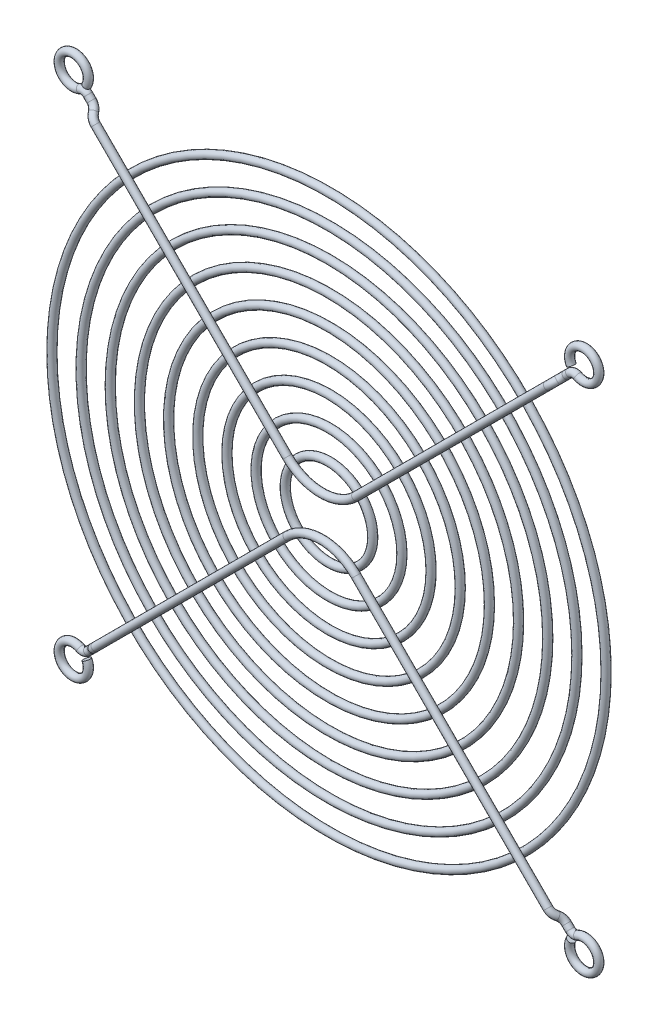
ISO-10303-21;
HEADER;
FILE_DESCRIPTION(('STEP AP214'),'2;1');
FILE_NAME('part.step','',(''),(''),'','','');
FILE_SCHEMA(('AUTOMOTIVE_DESIGN { 1 0 10303 214 1 1 1 1 }'));
ENDSEC;
DATA;
#1=APPLICATION_CONTEXT('core data for automotive mechanical design processes');
#2=APPLICATION_PROTOCOL_DEFINITION('international standard','automotive_design',2000,#1);
#3=PRODUCT_CONTEXT('',#1,'mechanical');
#4=PRODUCT('Part','Part','',(#3));
#5=PRODUCT_RELATED_PRODUCT_CATEGORY('part','',(#4));
#6=PRODUCT_DEFINITION_FORMATION('','',#4);
#7=PRODUCT_DEFINITION_CONTEXT('part definition',#1,'design');
#8=PRODUCT_DEFINITION('design','',#6,#7);
#9=PRODUCT_DEFINITION_SHAPE('','',#8);
#10=(LENGTH_UNIT() NAMED_UNIT(*) SI_UNIT(.MILLI.,.METRE.));
#11=(NAMED_UNIT(*) PLANE_ANGLE_UNIT() SI_UNIT($,.RADIAN.));
#12=(NAMED_UNIT(*) SI_UNIT($,.STERADIAN.) SOLID_ANGLE_UNIT());
#13=UNCERTAINTY_MEASURE_WITH_UNIT(LENGTH_MEASURE(1.E-05),#10,'distance_accuracy_value','');
#14=(GEOMETRIC_REPRESENTATION_CONTEXT(3) GLOBAL_UNCERTAINTY_ASSIGNED_CONTEXT((#13)) GLOBAL_UNIT_ASSIGNED_CONTEXT((#10,
#11,#12)) REPRESENTATION_CONTEXT('',''));
#15=CARTESIAN_POINT('',(0.,0.,0.));
#16=DIRECTION('',(0.,0.,1.));
#17=DIRECTION('',(1.,0.,0.));
#18=AXIS2_PLACEMENT_3D('',#15,#16,#17);
#19=CARTESIAN_POINT('',(-39.5979797464466,-39.5979797464467,1.5));
#20=DIRECTION('',(0.707106781186546,0.707106781186549,0.));
#21=DIRECTION('',(0.707106781186549,-0.707106781186546,0.));
#22=AXIS2_PLACEMENT_3D('',#19,#20,#21);
#23=CYLINDRICAL_SURFACE('',#22,0.75);
#24=CARTESIAN_POINT('',(-7.07106781186549,-7.07106781186551,1.5));
#25=DIRECTION('',(-0.707106781186546,-0.707106781186549,0.));
#26=DIRECTION('',(0.,0.,-1.));
#27=AXIS2_PLACEMENT_3D('',#24,#25,#26);
#28=CIRCLE('',#27,0.75);
#29=CARTESIAN_POINT('',(-7.6013978977554,-6.5407377259756,1.5));
#30=VERTEX_POINT('',#29);
#31=EDGE_CURVE('E11',#30,#30,#28,.T.);
#32=ORIENTED_EDGE('',*,*,#31,.T.);
#33=EDGE_LOOP('',(#32));
#34=FACE_BOUND('',#33,.T.);
#35=CARTESIAN_POINT('',(-46.5332744590506,-46.5332744590507,1.5));
#36=DIRECTION('',(-0.707106781186571,-0.707106781186524,0.));
#37=DIRECTION('',(0.707106781186524,-0.707106781186571,0.));
#38=AXIS2_PLACEMENT_3D('',#35,#36,#37);
#39=CIRCLE('',#38,0.750000000000743);
#40=CARTESIAN_POINT('',(-46.5332744590506,-46.5332744590507,2.25000000000074));
#41=VERTEX_POINT('',#40);
#42=EDGE_CURVE('E57',#41,#41,#39,.T.);
#43=ORIENTED_EDGE('',*,*,#42,.F.);
#44=EDGE_LOOP('',(#43));
#45=FACE_BOUND('',#44,.T.);
#46=ADVANCED_FACE('F46',(#34,#45),#23,.T.);
#47=CARTESIAN_POINT('',(0.,-14.142135623731,1.5));
#48=DIRECTION('',(0.,0.,1.));
#49=DIRECTION('',(1.,0.,0.));
#50=AXIS2_PLACEMENT_3D('',#47,#48,#49);
#51=TOROIDAL_SURFACE('',#50,10.,0.75);
#52=CARTESIAN_POINT('',(7.07106781186549,-7.07106781186551,1.5));
#53=DIRECTION('',(-0.707106781186546,0.707106781186549,0.));
#54=DIRECTION('',(0.,0.,-1.));
#55=AXIS2_PLACEMENT_3D('',#52,#53,#54);
#56=CIRCLE('',#55,0.75);
#57=CARTESIAN_POINT('',(7.6013978977554,-6.5407377259756,1.5));
#58=VERTEX_POINT('',#57);
#59=EDGE_CURVE('E75',#58,#58,#56,.T.);
#60=CARTESIAN_POINT('',(0.,-14.142135623731,1.5));
#61=DIRECTION('',(0.,0.,1.));
#62=DIRECTION('',(1.,0.,0.));
#63=AXIS2_PLACEMENT_3D('',#60,#61,#62);
#64=CIRCLE('',#63,10.75);
#65=EDGE_CURVE('',#58,#30,#64,.T.);
#66=ORIENTED_EDGE('',*,*,#59,.T.);
#67=ORIENTED_EDGE('',*,*,#31,.F.);
#68=ORIENTED_EDGE('',*,*,#65,.T.);
#69=ORIENTED_EDGE('',*,*,#65,.F.);
#70=EDGE_LOOP('',(#66,#68,#67,#69));
#71=FACE_BOUND('',#70,.T.);
#72=ADVANCED_FACE('F48',(#71),#51,.T.);
#73=CARTESIAN_POINT('',(-46.5332744590506,-46.5332744590507,-0.7));
#74=DIRECTION('',(-0.707106781186546,0.707106781186549,0.));
#75=DIRECTION('',(0.707106781186549,0.707106781186546,0.));
#76=AXIS2_PLACEMENT_3D('',#73,#74,#75);
#77=TOROIDAL_SURFACE('',#76,2.2,0.750000000000743);
#78=CARTESIAN_POINT('',(-47.7032103547303,-47.7032103547304,0.749999999999987));
#79=DIRECTION('',(-0.466047651236614,-0.466047651236567,-0.752063277626102));
#80=DIRECTION('',(0.707106781186532,-0.707106781186564,0.));
#81=AXIS2_PLACEMENT_3D('',#78,#79,#80);
#82=CIRCLE('',#81,0.750000000000743);
#83=CARTESIAN_POINT('',(-48.1020521373488,-48.1020521373489,1.24431818181865));
#84=VERTEX_POINT('',#83);
#85=EDGE_CURVE('E53',#84,#84,#82,.T.);
#86=CARTESIAN_POINT('',(-46.5332744590506,-46.5332744590507,-0.7));
#87=DIRECTION('',(-0.707106781186546,0.707106781186549,0.));
#88=DIRECTION('',(0.707106781186549,0.707106781186546,0.));
#89=AXIS2_PLACEMENT_3D('',#86,#87,#88);
#90=CIRCLE('',#89,2.95000000000074);
#91=EDGE_CURVE('',#84,#41,#90,.T.);
#92=ORIENTED_EDGE('',*,*,#85,.F.);
#93=ORIENTED_EDGE('',*,*,#42,.T.);
#94=ORIENTED_EDGE('',*,*,#91,.T.);
#95=ORIENTED_EDGE('',*,*,#91,.F.);
#96=EDGE_LOOP('',(#92,#94,#93,#95));
#97=FACE_BOUND('',#96,.T.);
#98=ADVANCED_FACE('F119',(#97),#77,.T.);
#99=CARTESIAN_POINT('',(-48.8731462504101,-48.8731462504102,2.2));
#100=DIRECTION('',(0.707106781186546,-0.707106781186549,0.));
#101=DIRECTION('',(-0.707106781186549,-0.707106781186546,0.));
#102=AXIS2_PLACEMENT_3D('',#99,#100,#101);
#103=TOROIDAL_SURFACE('',#102,2.2,0.750000000000743);
#104=CARTESIAN_POINT('',(-48.8731462504101,-48.8731462504101,0.));
#105=DIRECTION('',(-0.707106781186539,-0.707106781186556,0.));
#106=DIRECTION('',(0.707106781186556,-0.707106781186539,0.));
#107=AXIS2_PLACEMENT_3D('',#104,#105,#106);
#108=CIRCLE('',#107,0.750000000000001);
#109=CARTESIAN_POINT('',(-48.3428161645202,-49.4034763363,0.));
#110=VERTEX_POINT('',#109);
#111=EDGE_CURVE('E72',#110,#110,#108,.T.);
#112=ORIENTED_EDGE('',*,*,#111,.F.);
#113=EDGE_LOOP('',(#112));
#114=FACE_BOUND('',#113,.T.);
#115=ORIENTED_EDGE('',*,*,#85,.T.);
#116=EDGE_LOOP('',(#115));
#117=FACE_BOUND('',#116,.T.);
#118=ADVANCED_FACE('F123',(#114,#117),#103,.T.);
#119=CARTESIAN_POINT('',(-49.826980427435,-51.1380285007813,0.));
#120=DIRECTION('',(0.453990499739545,-0.891006524188369,0.));
#121=DIRECTION('',(-0.891006524188369,-0.453990499739545,0.));
#122=AXIS2_PLACEMENT_3D('',#119,#120,#121);
#123=PLANE('',#122);
#124=CARTESIAN_POINT('',(-49.826980427435,-51.1380285007813,0.));
#125=DIRECTION('',(-0.453990499739545,0.891006524188369,0.));
#126=DIRECTION('',(-0.891006524188369,-0.453990499739545,0.));
#127=AXIS2_PLACEMENT_3D('',#124,#125,#126);
#128=CIRCLE('',#127,0.750000000000001);
#129=CARTESIAN_POINT('',(-49.1587255342937,-50.7975356259766,0.));
#130=VERTEX_POINT('',#129);
#131=EDGE_CURVE('E66',#130,#130,#128,.T.);
#132=ORIENTED_EDGE('',*,*,#131,.T.);
#133=EDGE_LOOP('',(#132));
#134=FACE_BOUND('',#133,.T.);
#135=ADVANCED_FACE('F126',(#134),#123,.F.);
#136=CARTESIAN_POINT('',(-52.5,-52.5,0.));
#137=DIRECTION('',(0.,0.,1.));
#138=DIRECTION('',(1.,0.,0.));
#139=AXIS2_PLACEMENT_3D('',#136,#137,#138);
#140=TOROIDAL_SURFACE('',#139,2.99999999999998,0.750000000000001);
#141=CARTESIAN_POINT('',(-51.1380285007815,-49.8269804274349,0.));
#142=DIRECTION('',(-0.891006524188367,0.453990499739548,0.));
#143=DIRECTION('',(-0.453990499739548,-0.891006524188368,0.));
#144=AXIS2_PLACEMENT_3D('',#141,#142,#143);
#145=CIRCLE('',#144,0.750000000000001);
#146=CARTESIAN_POINT('',(-50.7975356259768,-49.1587255342936,0.));
#147=VERTEX_POINT('',#146);
#148=EDGE_CURVE('E61',#147,#147,#145,.T.);
#149=CARTESIAN_POINT('',(-52.5,-52.5,0.));
#150=DIRECTION('',(0.,0.,1.));
#151=DIRECTION('',(1.,0.,0.));
#152=AXIS2_PLACEMENT_3D('',#149,#150,#151);
#153=CIRCLE('',#152,3.74999999999998);
#154=EDGE_CURVE('',#147,#130,#153,.T.);
#155=ORIENTED_EDGE('',*,*,#148,.T.);
#156=ORIENTED_EDGE('',*,*,#131,.F.);
#157=ORIENTED_EDGE('',*,*,#154,.T.);
#158=ORIENTED_EDGE('',*,*,#154,.F.);
#159=EDGE_LOOP('',(#155,#157,#156,#158));
#160=FACE_BOUND('',#159,.T.);
#161=ADVANCED_FACE('F133',(#160),#140,.T.);
#162=CARTESIAN_POINT('',(-48.8731462504101,-48.8731462504101,0.));
#163=DIRECTION('',(-0.707106781186547,-0.707106781186547,0.));
#164=DIRECTION('',(-0.707106781186548,0.707106781186548,0.));
#165=AXIS2_PLACEMENT_3D('',#162,#163,#164);
#166=CYLINDRICAL_SURFACE('',#165,0.750000000000001);
#167=CARTESIAN_POINT('',(-49.5802530315966,-49.5802530315967,0.));
#168=DIRECTION('',(-0.707106781186539,-0.707106781186556,0.));
#169=DIRECTION('',(0.707106781186556,-0.707106781186539,0.));
#170=AXIS2_PLACEMENT_3D('',#167,#168,#169);
#171=CIRCLE('',#170,0.750000000000001);
#172=CARTESIAN_POINT('',(-49.0499229457067,-50.1105831174866,0.));
#173=VERTEX_POINT('',#172);
#174=EDGE_CURVE('E69',#173,#173,#171,.T.);
#175=ORIENTED_EDGE('',*,*,#174,.F.);
#176=EDGE_LOOP('',(#175));
#177=FACE_BOUND('',#176,.T.);
#178=ORIENTED_EDGE('',*,*,#111,.T.);
#179=EDGE_LOOP('',(#178));
#180=FACE_BOUND('',#179,.T.);
#181=ADVANCED_FACE('F137',(#177,#180),#166,.T.);
#182=CARTESIAN_POINT('',(-50.5289363296473,-48.6315697335461,0.));
#183=DIRECTION('',(0.,0.,1.));
#184=DIRECTION('',(1.,0.,0.));
#185=AXIS2_PLACEMENT_3D('',#182,#183,#184);
#186=TOROIDAL_SURFACE('',#185,1.34164078650009,0.750000000000001);
#187=ORIENTED_EDGE('',*,*,#148,.F.);
#188=EDGE_LOOP('',(#187));
#189=FACE_BOUND('',#188,.T.);
#190=ORIENTED_EDGE('',*,*,#174,.T.);
#191=EDGE_LOOP('',(#190));
#192=FACE_BOUND('',#191,.T.);
#193=ADVANCED_FACE('F139',(#189,#192),#186,.T.);
#194=CARTESIAN_POINT('',(39.5979797464466,-39.5979797464467,1.5));
#195=DIRECTION('',(-0.707106781186546,0.707106781186549,0.));
#196=DIRECTION('',(-0.707106781186549,-0.707106781186546,0.));
#197=AXIS2_PLACEMENT_3D('',#194,#195,#196);
#198=CYLINDRICAL_SURFACE('',#197,0.75);
#199=ORIENTED_EDGE('',*,*,#59,.F.);
#200=EDGE_LOOP('',(#199));
#201=FACE_BOUND('',#200,.T.);
#202=CARTESIAN_POINT('',(46.5332744590506,-46.5332744590507,1.5));
#203=DIRECTION('',(-0.707106781186571,0.707106781186524,0.));
#204=DIRECTION('',(-0.707106781186524,-0.707106781186571,0.));
#205=AXIS2_PLACEMENT_3D('',#202,#203,#204);
#206=CIRCLE('',#205,0.750000000000743);
#207=CARTESIAN_POINT('',(46.5332744590506,-46.5332744590507,2.25000000000074));
#208=VERTEX_POINT('',#207);
#209=EDGE_CURVE('E81',#208,#208,#206,.T.);
#210=ORIENTED_EDGE('',*,*,#209,.T.);
#211=EDGE_LOOP('',(#210));
#212=FACE_BOUND('',#211,.T.);
#213=ADVANCED_FACE('F142',(#201,#212),#198,.T.);
#214=CARTESIAN_POINT('',(46.5332744590506,-46.5332744590507,-0.7));
#215=DIRECTION('',(0.707106781186546,0.707106781186549,0.));
#216=DIRECTION('',(-0.707106781186549,0.707106781186546,0.));
#217=AXIS2_PLACEMENT_3D('',#214,#215,#216);
#218=TOROIDAL_SURFACE('',#217,2.2,0.750000000000743);
#219=CARTESIAN_POINT('',(47.7032103547303,-47.7032103547304,0.749999999999987));
#220=DIRECTION('',(-0.466047651236614,0.466047651236567,0.752063277626102));
#221=DIRECTION('',(-0.707106781186532,-0.707106781186564,0.));
#222=AXIS2_PLACEMENT_3D('',#219,#220,#221);
#223=CIRCLE('',#222,0.750000000000743);
#224=CARTESIAN_POINT('',(48.1020521373488,-48.1020521373489,1.24431818181865));
#225=VERTEX_POINT('',#224);
#226=EDGE_CURVE('E78',#225,#225,#223,.T.);
#227=CARTESIAN_POINT('',(46.5332744590506,-46.5332744590507,-0.7));
#228=DIRECTION('',(0.707106781186546,0.707106781186549,0.));
#229=DIRECTION('',(-0.707106781186549,0.707106781186546,0.));
#230=AXIS2_PLACEMENT_3D('',#227,#228,#229);
#231=CIRCLE('',#230,2.95000000000074);
#232=EDGE_CURVE('',#208,#225,#231,.T.);
#233=ORIENTED_EDGE('',*,*,#209,.F.);
#234=ORIENTED_EDGE('',*,*,#226,.T.);
#235=ORIENTED_EDGE('',*,*,#232,.T.);
#236=ORIENTED_EDGE('',*,*,#232,.F.);
#237=EDGE_LOOP('',(#233,#235,#234,#236));
#238=FACE_BOUND('',#237,.T.);
#239=ADVANCED_FACE('F149',(#238),#218,.T.);
#240=CARTESIAN_POINT('',(48.8731462504101,-48.8731462504102,2.2));
#241=DIRECTION('',(-0.707106781186546,-0.707106781186549,0.));
#242=DIRECTION('',(0.707106781186549,-0.707106781186546,0.));
#243=AXIS2_PLACEMENT_3D('',#240,#241,#242);
#244=TOROIDAL_SURFACE('',#243,2.2,0.750000000000743);
#245=CARTESIAN_POINT('',(48.8731462504101,-48.8731462504101,0.));
#246=DIRECTION('',(-0.707106781186539,0.707106781186556,0.));
#247=DIRECTION('',(-0.707106781186556,-0.707106781186539,0.));
#248=AXIS2_PLACEMENT_3D('',#245,#246,#247);
#249=CIRCLE('',#248,0.750000000000001);
#250=CARTESIAN_POINT('',(48.3428161645202,-49.4034763363,0.));
#251=VERTEX_POINT('',#250);
#252=EDGE_CURVE('E93',#251,#251,#249,.T.);
#253=ORIENTED_EDGE('',*,*,#252,.T.);
#254=EDGE_LOOP('',(#253));
#255=FACE_BOUND('',#254,.T.);
#256=ORIENTED_EDGE('',*,*,#226,.F.);
#257=EDGE_LOOP('',(#256));
#258=FACE_BOUND('',#257,.T.);
#259=ADVANCED_FACE('F97',(#255,#258),#244,.T.);
#260=CARTESIAN_POINT('',(49.826980427435,-51.1380285007813,0.));
#261=DIRECTION('',(-0.453990499739545,-0.891006524188369,0.));
#262=DIRECTION('',(0.891006524188369,-0.453990499739545,0.));
#263=AXIS2_PLACEMENT_3D('',#260,#261,#262);
#264=PLANE('',#263);
#265=CARTESIAN_POINT('',(49.826980427435,-51.1380285007813,0.));
#266=DIRECTION('',(-0.453990499739545,-0.891006524188369,0.));
#267=DIRECTION('',(0.891006524188369,-0.453990499739545,0.));
#268=AXIS2_PLACEMENT_3D('',#265,#266,#267);
#269=CIRCLE('',#268,0.750000000000001);
#270=CARTESIAN_POINT('',(49.1587255342937,-50.7975356259766,0.));
#271=VERTEX_POINT('',#270);
#272=EDGE_CURVE('E87',#271,#271,#269,.T.);
#273=ORIENTED_EDGE('',*,*,#272,.F.);
#274=EDGE_LOOP('',(#273));
#275=FACE_BOUND('',#274,.T.);
#276=ADVANCED_FACE('F112',(#275),#264,.F.);
#277=CARTESIAN_POINT('',(52.5,-52.5,0.));
#278=DIRECTION('',(0.,0.,1.));
#279=DIRECTION('',(-1.,0.,0.));
#280=AXIS2_PLACEMENT_3D('',#277,#278,#279);
#281=TOROIDAL_SURFACE('',#280,2.99999999999998,0.750000000000001);
#282=CARTESIAN_POINT('',(51.1380285007815,-49.8269804274349,0.));
#283=DIRECTION('',(-0.891006524188367,-0.453990499739548,0.));
#284=DIRECTION('',(0.453990499739548,-0.891006524188368,0.));
#285=AXIS2_PLACEMENT_3D('',#282,#283,#284);
#286=CIRCLE('',#285,0.750000000000001);
#287=CARTESIAN_POINT('',(50.7975356259768,-49.1587255342936,0.));
#288=VERTEX_POINT('',#287);
#289=EDGE_CURVE('E84',#288,#288,#286,.T.);
#290=CARTESIAN_POINT('',(52.5,-52.5,0.));
#291=DIRECTION('',(0.,0.,1.));
#292=DIRECTION('',(-1.,0.,0.));
#293=AXIS2_PLACEMENT_3D('',#290,#291,#292);
#294=CIRCLE('',#293,3.74999999999998);
#295=EDGE_CURVE('',#271,#288,#294,.T.);
#296=ORIENTED_EDGE('',*,*,#272,.T.);
#297=ORIENTED_EDGE('',*,*,#289,.F.);
#298=ORIENTED_EDGE('',*,*,#295,.T.);
#299=ORIENTED_EDGE('',*,*,#295,.F.);
#300=EDGE_LOOP('',(#296,#298,#297,#299));
#301=FACE_BOUND('',#300,.T.);
#302=ADVANCED_FACE('F103',(#301),#281,.T.);
#303=CARTESIAN_POINT('',(48.8731462504101,-48.8731462504101,0.));
#304=DIRECTION('',(0.707106781186547,-0.707106781186547,0.));
#305=DIRECTION('',(0.707106781186548,0.707106781186548,0.));
#306=AXIS2_PLACEMENT_3D('',#303,#304,#305);
#307=CYLINDRICAL_SURFACE('',#306,0.750000000000001);
#308=CARTESIAN_POINT('',(49.5802530315966,-49.5802530315967,0.));
#309=DIRECTION('',(-0.707106781186539,0.707106781186556,0.));
#310=DIRECTION('',(-0.707106781186556,-0.707106781186539,0.));
#311=AXIS2_PLACEMENT_3D('',#308,#309,#310);
#312=CIRCLE('',#311,0.750000000000001);
#313=CARTESIAN_POINT('',(49.0499229457067,-50.1105831174866,0.));
#314=VERTEX_POINT('',#313);
#315=EDGE_CURVE('E90',#314,#314,#312,.T.);
#316=ORIENTED_EDGE('',*,*,#315,.T.);
#317=EDGE_LOOP('',(#316));
#318=FACE_BOUND('',#317,.T.);
#319=ORIENTED_EDGE('',*,*,#252,.F.);
#320=EDGE_LOOP('',(#319));
#321=FACE_BOUND('',#320,.T.);
#322=ADVANCED_FACE('F100',(#318,#321),#307,.T.);
#323=CARTESIAN_POINT('',(50.5289363296473,-48.6315697335461,0.));
#324=DIRECTION('',(0.,0.,1.));
#325=DIRECTION('',(-1.,0.,0.));
#326=AXIS2_PLACEMENT_3D('',#323,#324,#325);
#327=TOROIDAL_SURFACE('',#326,1.34164078650009,0.750000000000001);
#328=ORIENTED_EDGE('',*,*,#289,.T.);
#329=EDGE_LOOP('',(#328));
#330=FACE_BOUND('',#329,.T.);
#331=ORIENTED_EDGE('',*,*,#315,.F.);
#332=EDGE_LOOP('',(#331));
#333=FACE_BOUND('',#332,.T.);
#334=ADVANCED_FACE('F102',(#330,#333),#327,.T.);
#335=CLOSED_SHELL('',(#46,#72,#98,#118,#135,#161,#181,#193,#213,#239,#259,#276,#302,#322,#334));
#336=MANIFOLD_SOLID_BREP('B2',#335);
#337=CARTESIAN_POINT('',(-39.5979797464466,39.5979797464467,1.5));
#338=DIRECTION('',(0.707106781186546,-0.707106781186549,0.));
#339=DIRECTION('',(0.707106781186549,0.707106781186546,0.));
#340=AXIS2_PLACEMENT_3D('',#337,#338,#339);
#341=CYLINDRICAL_SURFACE('',#340,0.75);
#342=CARTESIAN_POINT('',(-7.07106781186549,7.07106781186551,1.5));
#343=DIRECTION('',(0.707106781186546,-0.707106781186549,0.));
#344=DIRECTION('',(0.,0.,-1.));
#345=AXIS2_PLACEMENT_3D('',#342,#343,#344);
#346=CIRCLE('',#345,0.75);
#347=CARTESIAN_POINT('',(-7.6013978977554,6.5407377259756,1.5));
#348=VERTEX_POINT('',#347);
#349=EDGE_CURVE('E45',#348,#348,#346,.T.);
#350=ORIENTED_EDGE('',*,*,#349,.F.);
#351=EDGE_LOOP('',(#350));
#352=FACE_BOUND('',#351,.T.);
#353=CARTESIAN_POINT('',(-46.5332744590506,46.5332744590507,1.5));
#354=DIRECTION('',(0.707106781186571,-0.707106781186524,0.));
#355=DIRECTION('',(0.707106781186524,0.707106781186571,0.));
#356=AXIS2_PLACEMENT_3D('',#353,#354,#355);
#357=CIRCLE('',#356,0.750000000000743);
#358=CARTESIAN_POINT('',(-46.5332744590506,46.5332744590507,2.25000000000074));
#359=VERTEX_POINT('',#358);
#360=EDGE_CURVE('E293',#359,#359,#357,.T.);
#361=ORIENTED_EDGE('',*,*,#360,.T.);
#362=EDGE_LOOP('',(#361));
#363=FACE_BOUND('',#362,.T.);
#364=ADVANCED_FACE('F282',(#352,#363),#341,.T.);
#365=CARTESIAN_POINT('',(0.,14.142135623731,1.5));
#366=DIRECTION('',(0.,0.,1.));
#367=DIRECTION('',(1.,0.,0.));
#368=AXIS2_PLACEMENT_3D('',#365,#366,#367);
#369=TOROIDAL_SURFACE('',#368,10.,0.75);
#370=CARTESIAN_POINT('',(7.07106781186549,7.07106781186551,1.5));
#371=DIRECTION('',(0.707106781186546,0.707106781186549,0.));
#372=DIRECTION('',(0.,0.,-1.));
#373=AXIS2_PLACEMENT_3D('',#370,#371,#372);
#374=CIRCLE('',#373,0.75);
#375=CARTESIAN_POINT('',(7.6013978977554,6.5407377259756,1.5));
#376=VERTEX_POINT('',#375);
#377=EDGE_CURVE('E311',#376,#376,#374,.T.);
#378=CARTESIAN_POINT('',(0.,14.142135623731,1.5));
#379=DIRECTION('',(0.,0.,1.));
#380=DIRECTION('',(1.,0.,0.));
#381=AXIS2_PLACEMENT_3D('',#378,#379,#380);
#382=CIRCLE('',#381,10.75);
#383=EDGE_CURVE('',#348,#376,#382,.T.);
#384=ORIENTED_EDGE('',*,*,#349,.T.);
#385=ORIENTED_EDGE('',*,*,#377,.F.);
#386=ORIENTED_EDGE('',*,*,#383,.T.);
#387=ORIENTED_EDGE('',*,*,#383,.F.);
#388=EDGE_LOOP('',(#384,#386,#385,#387));
#389=FACE_BOUND('',#388,.T.);
#390=ADVANCED_FACE('F284',(#389),#369,.T.);
#391=CARTESIAN_POINT('',(-46.5332744590506,46.5332744590507,-0.7));
#392=DIRECTION('',(-0.707106781186546,-0.707106781186549,0.));
#393=DIRECTION('',(0.707106781186549,-0.707106781186546,0.));
#394=AXIS2_PLACEMENT_3D('',#391,#392,#393);
#395=TOROIDAL_SURFACE('',#394,2.2,0.750000000000743);
#396=CARTESIAN_POINT('',(-47.7032103547303,47.7032103547304,0.749999999999987));
#397=DIRECTION('',(0.466047651236614,-0.466047651236567,0.752063277626102));
#398=DIRECTION('',(0.707106781186532,0.707106781186564,0.));
#399=AXIS2_PLACEMENT_3D('',#396,#397,#398);
#400=CIRCLE('',#399,0.750000000000743);
#401=CARTESIAN_POINT('',(-48.1020521373488,48.1020521373489,1.24431818181865));
#402=VERTEX_POINT('',#401);
#403=EDGE_CURVE('E289',#402,#402,#400,.T.);
#404=CARTESIAN_POINT('',(-46.5332744590506,46.5332744590507,-0.7));
#405=DIRECTION('',(-0.707106781186546,-0.707106781186549,0.));
#406=DIRECTION('',(0.707106781186549,-0.707106781186546,0.));
#407=AXIS2_PLACEMENT_3D('',#404,#405,#406);
#408=CIRCLE('',#407,2.95000000000074);
#409=EDGE_CURVE('',#359,#402,#408,.T.);
#410=ORIENTED_EDGE('',*,*,#360,.F.);
#411=ORIENTED_EDGE('',*,*,#403,.T.);
#412=ORIENTED_EDGE('',*,*,#409,.T.);
#413=ORIENTED_EDGE('',*,*,#409,.F.);
#414=EDGE_LOOP('',(#410,#412,#411,#413));
#415=FACE_BOUND('',#414,.T.);
#416=ADVANCED_FACE('F365',(#415),#395,.T.);
#417=CARTESIAN_POINT('',(-48.8731462504101,48.8731462504102,2.2));
#418=DIRECTION('',(0.707106781186546,0.707106781186549,0.));
#419=DIRECTION('',(-0.707106781186549,0.707106781186546,0.));
#420=AXIS2_PLACEMENT_3D('',#417,#418,#419);
#421=TOROIDAL_SURFACE('',#420,2.2,0.750000000000743);
#422=CARTESIAN_POINT('',(-48.8731462504101,48.8731462504101,0.));
#423=DIRECTION('',(0.707106781186539,-0.707106781186556,0.));
#424=DIRECTION('',(0.707106781186556,0.707106781186539,0.));
#425=AXIS2_PLACEMENT_3D('',#422,#423,#424);
#426=CIRCLE('',#425,0.750000000000001);
#427=CARTESIAN_POINT('',(-48.3428161645202,49.4034763363,0.));
#428=VERTEX_POINT('',#427);
#429=EDGE_CURVE('E308',#428,#428,#426,.T.);
#430=ORIENTED_EDGE('',*,*,#429,.T.);
#431=EDGE_LOOP('',(#430));
#432=FACE_BOUND('',#431,.T.);
#433=ORIENTED_EDGE('',*,*,#403,.F.);
#434=EDGE_LOOP('',(#433));
#435=FACE_BOUND('',#434,.T.);
#436=ADVANCED_FACE('F370',(#432,#435),#421,.T.);
#437=CARTESIAN_POINT('',(-49.826980427435,51.1380285007813,0.));
#438=DIRECTION('',(0.453990499739545,0.891006524188369,0.));
#439=DIRECTION('',(-0.891006524188369,0.453990499739545,0.));
#440=AXIS2_PLACEMENT_3D('',#437,#438,#439);
#441=PLANE('',#440);
#442=CARTESIAN_POINT('',(-49.826980427435,51.1380285007813,0.));
#443=DIRECTION('',(0.453990499739545,0.891006524188369,0.));
#444=DIRECTION('',(-0.891006524188369,0.453990499739545,0.));
#445=AXIS2_PLACEMENT_3D('',#442,#443,#444);
#446=CIRCLE('',#445,0.750000000000001);
#447=CARTESIAN_POINT('',(-49.1587255342937,50.7975356259766,0.));
#448=VERTEX_POINT('',#447);
#449=EDGE_CURVE('E302',#448,#448,#446,.T.);
#450=ORIENTED_EDGE('',*,*,#449,.F.);
#451=EDGE_LOOP('',(#450));
#452=FACE_BOUND('',#451,.T.);
#453=ADVANCED_FACE('F360',(#452),#441,.F.);
#454=CARTESIAN_POINT('',(-52.5,52.5,0.));
#455=DIRECTION('',(0.,0.,1.));
#456=DIRECTION('',(1.,0.,0.));
#457=AXIS2_PLACEMENT_3D('',#454,#455,#456);
#458=TOROIDAL_SURFACE('',#457,2.99999999999998,0.750000000000001);
#459=CARTESIAN_POINT('',(-51.1380285007815,49.8269804274349,0.));
#460=DIRECTION('',(0.891006524188367,0.453990499739548,0.));
#461=DIRECTION('',(-0.453990499739548,0.891006524188368,0.));
#462=AXIS2_PLACEMENT_3D('',#459,#460,#461);
#463=CIRCLE('',#462,0.750000000000001);
#464=CARTESIAN_POINT('',(-50.7975356259768,49.1587255342936,0.));
#465=VERTEX_POINT('',#464);
#466=EDGE_CURVE('E297',#465,#465,#463,.T.);
#467=CARTESIAN_POINT('',(-52.5,52.5,0.));
#468=DIRECTION('',(0.,0.,1.));
#469=DIRECTION('',(1.,0.,0.));
#470=AXIS2_PLACEMENT_3D('',#467,#468,#469);
#471=CIRCLE('',#470,3.74999999999998);
#472=EDGE_CURVE('',#448,#465,#471,.T.);
#473=ORIENTED_EDGE('',*,*,#449,.T.);
#474=ORIENTED_EDGE('',*,*,#466,.F.);
#475=ORIENTED_EDGE('',*,*,#472,.T.);
#476=ORIENTED_EDGE('',*,*,#472,.F.);
#477=EDGE_LOOP('',(#473,#475,#474,#476));
#478=FACE_BOUND('',#477,.T.);
#479=ADVANCED_FACE('F363',(#478),#458,.T.);
#480=CARTESIAN_POINT('',(-48.8731462504101,48.8731462504101,0.));
#481=DIRECTION('',(-0.707106781186547,0.707106781186547,0.));
#482=DIRECTION('',(-0.707106781186548,-0.707106781186548,0.));
#483=AXIS2_PLACEMENT_3D('',#480,#481,#482);
#484=CYLINDRICAL_SURFACE('',#483,0.750000000000001);
#485=CARTESIAN_POINT('',(-49.5802530315966,49.5802530315967,0.));
#486=DIRECTION('',(0.707106781186539,-0.707106781186556,0.));
#487=DIRECTION('',(0.707106781186556,0.707106781186539,0.));
#488=AXIS2_PLACEMENT_3D('',#485,#486,#487);
#489=CIRCLE('',#488,0.750000000000001);
#490=CARTESIAN_POINT('',(-49.0499229457067,50.1105831174866,0.));
#491=VERTEX_POINT('',#490);
#492=EDGE_CURVE('E305',#491,#491,#489,.T.);
#493=ORIENTED_EDGE('',*,*,#492,.T.);
#494=EDGE_LOOP('',(#493));
#495=FACE_BOUND('',#494,.T.);
#496=ORIENTED_EDGE('',*,*,#429,.F.);
#497=EDGE_LOOP('',(#496));
#498=FACE_BOUND('',#497,.T.);
#499=ADVANCED_FACE('F353',(#495,#498),#484,.T.);
#500=CARTESIAN_POINT('',(-50.5289363296473,48.6315697335461,0.));
#501=DIRECTION('',(0.,0.,1.));
#502=DIRECTION('',(1.,0.,0.));
#503=AXIS2_PLACEMENT_3D('',#500,#501,#502);
#504=TOROIDAL_SURFACE('',#503,1.34164078650009,0.750000000000001);
#505=ORIENTED_EDGE('',*,*,#466,.T.);
#506=EDGE_LOOP('',(#505));
#507=FACE_BOUND('',#506,.T.);
#508=ORIENTED_EDGE('',*,*,#492,.F.);
#509=EDGE_LOOP('',(#508));
#510=FACE_BOUND('',#509,.T.);
#511=ADVANCED_FACE('F350',(#507,#510),#504,.T.);
#512=CARTESIAN_POINT('',(39.5979797464466,39.5979797464467,1.5));
#513=DIRECTION('',(-0.707106781186546,-0.707106781186549,0.));
#514=DIRECTION('',(-0.707106781186549,0.707106781186546,0.));
#515=AXIS2_PLACEMENT_3D('',#512,#513,#514);
#516=CYLINDRICAL_SURFACE('',#515,0.75);
#517=ORIENTED_EDGE('',*,*,#377,.T.);
#518=EDGE_LOOP('',(#517));
#519=FACE_BOUND('',#518,.T.);
#520=CARTESIAN_POINT('',(46.5332744590506,46.5332744590507,1.5));
#521=DIRECTION('',(0.707106781186571,0.707106781186524,0.));
#522=DIRECTION('',(-0.707106781186524,0.707106781186571,0.));
#523=AXIS2_PLACEMENT_3D('',#520,#521,#522);
#524=CIRCLE('',#523,0.750000000000743);
#525=CARTESIAN_POINT('',(46.5332744590506,46.5332744590507,2.25000000000074));
#526=VERTEX_POINT('',#525);
#527=EDGE_CURVE('E317',#526,#526,#524,.T.);
#528=ORIENTED_EDGE('',*,*,#527,.F.);
#529=EDGE_LOOP('',(#528));
#530=FACE_BOUND('',#529,.T.);
#531=ADVANCED_FACE('F345',(#519,#530),#516,.T.);
#532=CARTESIAN_POINT('',(46.5332744590506,46.5332744590507,-0.7));
#533=DIRECTION('',(0.707106781186546,-0.707106781186549,0.));
#534=DIRECTION('',(-0.707106781186549,-0.707106781186546,0.));
#535=AXIS2_PLACEMENT_3D('',#532,#533,#534);
#536=TOROIDAL_SURFACE('',#535,2.2,0.750000000000743);
#537=CARTESIAN_POINT('',(47.7032103547303,47.7032103547304,0.749999999999987));
#538=DIRECTION('',(0.466047651236614,0.466047651236567,-0.752063277626102));
#539=DIRECTION('',(-0.707106781186532,0.707106781186564,0.));
#540=AXIS2_PLACEMENT_3D('',#537,#538,#539);
#541=CIRCLE('',#540,0.750000000000743);
#542=CARTESIAN_POINT('',(48.1020521373488,48.1020521373489,1.24431818181865));
#543=VERTEX_POINT('',#542);
#544=EDGE_CURVE('E314',#543,#543,#541,.T.);
#545=CARTESIAN_POINT('',(46.5332744590506,46.5332744590507,-0.7));
#546=DIRECTION('',(0.707106781186546,-0.707106781186549,0.));
#547=DIRECTION('',(-0.707106781186549,-0.707106781186546,0.));
#548=AXIS2_PLACEMENT_3D('',#545,#546,#547);
#549=CIRCLE('',#548,2.95000000000074);
#550=EDGE_CURVE('',#543,#526,#549,.T.);
#551=ORIENTED_EDGE('',*,*,#544,.F.);
#552=ORIENTED_EDGE('',*,*,#527,.T.);
#553=ORIENTED_EDGE('',*,*,#550,.T.);
#554=ORIENTED_EDGE('',*,*,#550,.F.);
#555=EDGE_LOOP('',(#551,#553,#552,#554));
#556=FACE_BOUND('',#555,.T.);
#557=ADVANCED_FACE('F339',(#556),#536,.T.);
#558=CARTESIAN_POINT('',(48.8731462504101,48.8731462504102,2.2));
#559=DIRECTION('',(-0.707106781186546,0.707106781186549,0.));
#560=DIRECTION('',(0.707106781186549,0.707106781186546,0.));
#561=AXIS2_PLACEMENT_3D('',#558,#559,#560);
#562=TOROIDAL_SURFACE('',#561,2.2,0.750000000000743);
#563=CARTESIAN_POINT('',(48.8731462504101,48.8731462504101,0.));
#564=DIRECTION('',(0.707106781186539,0.707106781186556,0.));
#565=DIRECTION('',(-0.707106781186556,0.707106781186539,0.));
#566=AXIS2_PLACEMENT_3D('',#563,#564,#565);
#567=CIRCLE('',#566,0.750000000000001);
#568=CARTESIAN_POINT('',(48.3428161645202,49.4034763363,0.));
#569=VERTEX_POINT('',#568);
#570=EDGE_CURVE('E329',#569,#569,#567,.T.);
#571=ORIENTED_EDGE('',*,*,#570,.F.);
#572=EDGE_LOOP('',(#571));
#573=FACE_BOUND('',#572,.T.);
#574=ORIENTED_EDGE('',*,*,#544,.T.);
#575=EDGE_LOOP('',(#574));
#576=FACE_BOUND('',#575,.T.);
#577=ADVANCED_FACE('F335',(#573,#576),#562,.T.);
#578=CARTESIAN_POINT('',(49.826980427435,51.1380285007813,0.));
#579=DIRECTION('',(-0.453990499739545,0.891006524188369,0.));
#580=DIRECTION('',(0.891006524188369,0.453990499739545,0.));
#581=AXIS2_PLACEMENT_3D('',#578,#579,#580);
#582=PLANE('',#581);
#583=CARTESIAN_POINT('',(49.826980427435,51.1380285007813,0.));
#584=DIRECTION('',(0.453990499739545,-0.891006524188369,0.));
#585=DIRECTION('',(0.891006524188369,0.453990499739545,0.));
#586=AXIS2_PLACEMENT_3D('',#583,#584,#585);
#587=CIRCLE('',#586,0.750000000000001);
#588=CARTESIAN_POINT('',(49.1587255342937,50.7975356259766,0.));
#589=VERTEX_POINT('',#588);
#590=EDGE_CURVE('E323',#589,#589,#587,.T.);
#591=ORIENTED_EDGE('',*,*,#590,.T.);
#592=EDGE_LOOP('',(#591));
#593=FACE_BOUND('',#592,.T.);
#594=ADVANCED_FACE('F338',(#593),#582,.F.);
#595=CARTESIAN_POINT('',(52.5,52.5,0.));
#596=DIRECTION('',(0.,0.,1.));
#597=DIRECTION('',(-1.,0.,0.));
#598=AXIS2_PLACEMENT_3D('',#595,#596,#597);
#599=TOROIDAL_SURFACE('',#598,2.99999999999998,0.750000000000001);
#600=CARTESIAN_POINT('',(51.1380285007815,49.8269804274349,0.));
#601=DIRECTION('',(0.891006524188367,-0.453990499739548,0.));
#602=DIRECTION('',(0.453990499739548,0.891006524188368,0.));
#603=AXIS2_PLACEMENT_3D('',#600,#601,#602);
#604=CIRCLE('',#603,0.750000000000001);
#605=CARTESIAN_POINT('',(50.7975356259768,49.1587255342936,0.));
#606=VERTEX_POINT('',#605);
#607=EDGE_CURVE('E320',#606,#606,#604,.T.);
#608=CARTESIAN_POINT('',(52.5,52.5,0.));
#609=DIRECTION('',(0.,0.,1.));
#610=DIRECTION('',(-1.,0.,0.));
#611=AXIS2_PLACEMENT_3D('',#608,#609,#610);
#612=CIRCLE('',#611,3.74999999999998);
#613=EDGE_CURVE('',#606,#589,#612,.T.);
#614=ORIENTED_EDGE('',*,*,#607,.T.);
#615=ORIENTED_EDGE('',*,*,#590,.F.);
#616=ORIENTED_EDGE('',*,*,#613,.T.);
#617=ORIENTED_EDGE('',*,*,#613,.F.);
#618=EDGE_LOOP('',(#614,#616,#615,#617));
#619=FACE_BOUND('',#618,.T.);
#620=ADVANCED_FACE('F459',(#619),#599,.T.);
#621=CARTESIAN_POINT('',(48.8731462504101,48.8731462504101,0.));
#622=DIRECTION('',(0.707106781186547,0.707106781186547,0.));
#623=DIRECTION('',(0.707106781186548,-0.707106781186548,0.));
#624=AXIS2_PLACEMENT_3D('',#621,#622,#623);
#625=CYLINDRICAL_SURFACE('',#624,0.750000000000001);
#626=CARTESIAN_POINT('',(49.5802530315966,49.5802530315967,0.));
#627=DIRECTION('',(0.707106781186539,0.707106781186556,0.));
#628=DIRECTION('',(-0.707106781186556,0.707106781186539,0.));
#629=AXIS2_PLACEMENT_3D('',#626,#627,#628);
#630=CIRCLE('',#629,0.750000000000001);
#631=CARTESIAN_POINT('',(49.0499229457067,50.1105831174866,0.));
#632=VERTEX_POINT('',#631);
#633=EDGE_CURVE('E326',#632,#632,#630,.T.);
#634=ORIENTED_EDGE('',*,*,#633,.F.);
#635=EDGE_LOOP('',(#634));
#636=FACE_BOUND('',#635,.T.);
#637=ORIENTED_EDGE('',*,*,#570,.T.);
#638=EDGE_LOOP('',(#637));
#639=FACE_BOUND('',#638,.T.);
#640=ADVANCED_FACE('F333',(#636,#639),#625,.T.);
#641=CARTESIAN_POINT('',(50.5289363296473,48.6315697335461,0.));
#642=DIRECTION('',(0.,0.,1.));
#643=DIRECTION('',(-1.,0.,0.));
#644=AXIS2_PLACEMENT_3D('',#641,#642,#643);
#645=TOROIDAL_SURFACE('',#644,1.34164078650009,0.750000000000001);
#646=ORIENTED_EDGE('',*,*,#607,.F.);
#647=EDGE_LOOP('',(#646));
#648=FACE_BOUND('',#647,.T.);
#649=ORIENTED_EDGE('',*,*,#633,.T.);
#650=EDGE_LOOP('',(#649));
#651=FACE_BOUND('',#650,.T.);
#652=ADVANCED_FACE('F478',(#648,#651),#645,.T.);
#653=CLOSED_SHELL('',(#364,#390,#416,#436,#453,#479,#499,#511,#531,#557,#577,#594,#620,#640,#652));
#654=MANIFOLD_SOLID_BREP('B6',#653);
#655=CARTESIAN_POINT('',(0.,0.,0.));
#656=DIRECTION('',(0.,0.,1.));
#657=DIRECTION('',(1.,0.,0.));
#658=AXIS2_PLACEMENT_3D('',#655,#656,#657);
#659=TOROIDAL_SURFACE('',#658,57.,0.749999999999999);
#660=CARTESIAN_POINT('',(57.75,0.,0.));
#661=VERTEX_POINT('',#660);
#662=VERTEX_LOOP('',#661);
#663=FACE_BOUND('',#662,.T.);
#664=ADVANCED_FACE('F518',(#663),#659,.T.);
#665=CLOSED_SHELL('',(#664));
#666=MANIFOLD_SOLID_BREP('B40',#665);
#667=CARTESIAN_POINT('',(0.,0.,0.));
#668=DIRECTION('',(0.,0.,1.));
#669=DIRECTION('',(1.,0.,0.));
#670=AXIS2_PLACEMENT_3D('',#667,#668,#669);
#671=TOROIDAL_SURFACE('',#670,51.,0.749999999999999);
#672=CARTESIAN_POINT('',(51.75,0.,0.));
#673=VERTEX_POINT('',#672);
#674=VERTEX_LOOP('',#673);
#675=FACE_BOUND('',#674,.T.);
#676=ADVANCED_FACE('F537',(#675),#671,.T.);
#677=CLOSED_SHELL('',(#676));
#678=MANIFOLD_SOLID_BREP('B278',#677);
#679=CARTESIAN_POINT('',(0.,0.,0.));
#680=DIRECTION('',(0.,0.,1.));
#681=DIRECTION('',(1.,0.,0.));
#682=AXIS2_PLACEMENT_3D('',#679,#680,#681);
#683=TOROIDAL_SURFACE('',#682,45.,0.749999999999999);
#684=CARTESIAN_POINT('',(45.75,0.,0.));
#685=VERTEX_POINT('',#684);
#686=VERTEX_LOOP('',#685);
#687=FACE_BOUND('',#686,.T.);
#688=ADVANCED_FACE('F556',(#687),#683,.T.);
#689=CLOSED_SHELL('',(#688));
#690=MANIFOLD_SOLID_BREP('B514',#689);
#691=CARTESIAN_POINT('',(0.,0.,0.));
#692=DIRECTION('',(0.,0.,1.));
#693=DIRECTION('',(1.,0.,0.));
#694=AXIS2_PLACEMENT_3D('',#691,#692,#693);
#695=TOROIDAL_SURFACE('',#694,39.,0.749999999999999);
#696=CARTESIAN_POINT('',(39.75,0.,0.));
#697=VERTEX_POINT('',#696);
#698=VERTEX_LOOP('',#697);
#699=FACE_BOUND('',#698,.T.);
#700=ADVANCED_FACE('F575',(#699),#695,.T.);
#701=CLOSED_SHELL('',(#700));
#702=MANIFOLD_SOLID_BREP('B533',#701);
#703=CARTESIAN_POINT('',(0.,0.,0.));
#704=DIRECTION('',(0.,0.,1.));
#705=DIRECTION('',(1.,0.,0.));
#706=AXIS2_PLACEMENT_3D('',#703,#704,#705);
#707=TOROIDAL_SURFACE('',#706,33.,0.749999999999999);
#708=CARTESIAN_POINT('',(33.75,0.,0.));
#709=VERTEX_POINT('',#708);
#710=VERTEX_LOOP('',#709);
#711=FACE_BOUND('',#710,.T.);
#712=ADVANCED_FACE('F594',(#711),#707,.T.);
#713=CLOSED_SHELL('',(#712));
#714=MANIFOLD_SOLID_BREP('B552',#713);
#715=CARTESIAN_POINT('',(0.,0.,0.));
#716=DIRECTION('',(0.,0.,1.));
#717=DIRECTION('',(1.,0.,0.));
#718=AXIS2_PLACEMENT_3D('',#715,#716,#717);
#719=TOROIDAL_SURFACE('',#718,27.,0.749999999999998);
#720=CARTESIAN_POINT('',(27.75,0.,0.));
#721=VERTEX_POINT('',#720);
#722=VERTEX_LOOP('',#721);
#723=FACE_BOUND('',#722,.T.);
#724=ADVANCED_FACE('F613',(#723),#719,.T.);
#725=CLOSED_SHELL('',(#724));
#726=MANIFOLD_SOLID_BREP('B571',#725);
#727=CARTESIAN_POINT('',(0.,0.,0.));
#728=DIRECTION('',(0.,0.,1.));
#729=DIRECTION('',(1.,0.,0.));
#730=AXIS2_PLACEMENT_3D('',#727,#728,#729);
#731=TOROIDAL_SURFACE('',#730,21.,0.750000000000002);
#732=CARTESIAN_POINT('',(21.75,0.,0.));
#733=VERTEX_POINT('',#732);
#734=VERTEX_LOOP('',#733);
#735=FACE_BOUND('',#734,.T.);
#736=ADVANCED_FACE('F632',(#735),#731,.T.);
#737=CLOSED_SHELL('',(#736));
#738=MANIFOLD_SOLID_BREP('B590',#737);
#739=CARTESIAN_POINT('',(0.,0.,0.));
#740=DIRECTION('',(0.,0.,1.));
#741=DIRECTION('',(1.,0.,0.));
#742=AXIS2_PLACEMENT_3D('',#739,#740,#741);
#743=TOROIDAL_SURFACE('',#742,15.,0.750000000000002);
#744=CARTESIAN_POINT('',(15.75,0.,0.));
#745=VERTEX_POINT('',#744);
#746=VERTEX_LOOP('',#745);
#747=FACE_BOUND('',#746,.T.);
#748=ADVANCED_FACE('F650',(#747),#743,.T.);
#749=CLOSED_SHELL('',(#748));
#750=MANIFOLD_SOLID_BREP('B609',#749);
#751=CARTESIAN_POINT('',(0.,0.,0.));
#752=DIRECTION('',(0.,0.,1.));
#753=DIRECTION('',(1.,0.,0.));
#754=AXIS2_PLACEMENT_3D('',#751,#752,#753);
#755=TOROIDAL_SURFACE('',#754,9.,0.75);
#756=CARTESIAN_POINT('',(9.75,0.,0.));
#757=VERTEX_POINT('',#756);
#758=VERTEX_LOOP('',#757);
#759=FACE_BOUND('',#758,.T.);
#760=ADVANCED_FACE('F663',(#759),#755,.T.);
#761=CLOSED_SHELL('',(#760));
#762=MANIFOLD_SOLID_BREP('B628',#761);
#763=ADVANCED_BREP_SHAPE_REPRESENTATION('',(#18,#336,#654,#666,#678,#690,#702,#714,#726,#738,
#750,#762),#14);
#764=SHAPE_DEFINITION_REPRESENTATION(#9,#763);
ENDSEC;
END-ISO-10303-21;
